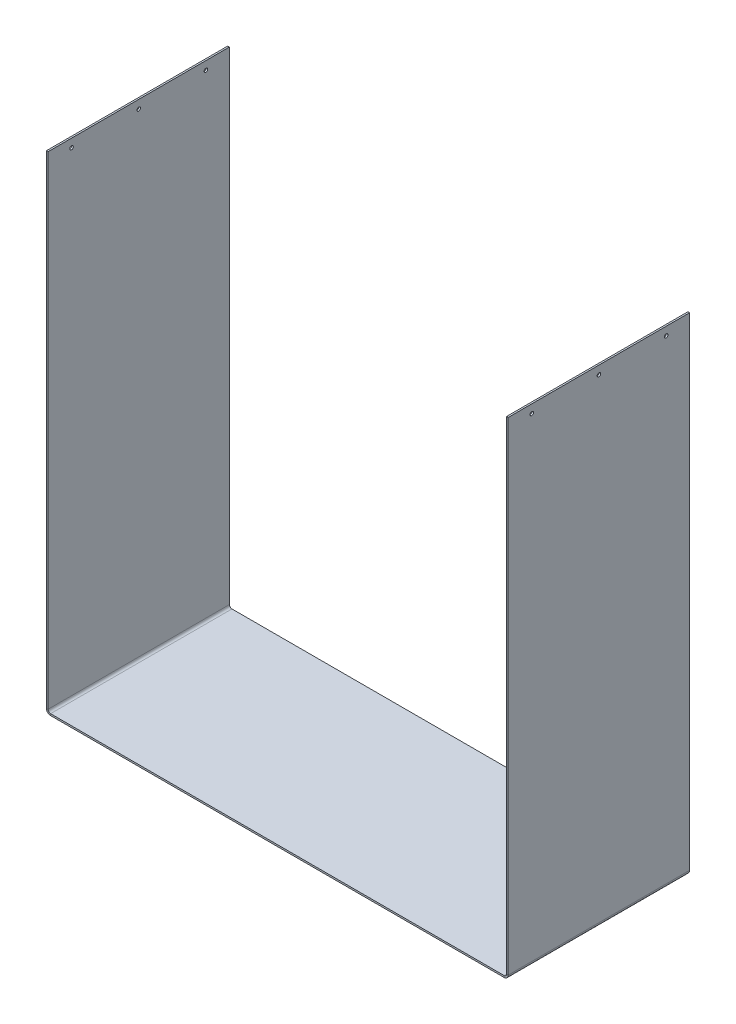
ISO-10303-21;
HEADER;
FILE_DESCRIPTION(('STEP AP214'),'2;1');
FILE_NAME('part.step','',(''),(''),'','','');
FILE_SCHEMA(('AUTOMOTIVE_DESIGN { 1 0 10303 214 1 1 1 1 }'));
ENDSEC;
DATA;
#1=APPLICATION_CONTEXT('core data for automotive mechanical design processes');
#2=APPLICATION_PROTOCOL_DEFINITION('international standard','automotive_design',2000,#1);
#3=PRODUCT_CONTEXT('',#1,'mechanical');
#4=PRODUCT('Part','Part','',(#3));
#5=PRODUCT_RELATED_PRODUCT_CATEGORY('part','',(#4));
#6=PRODUCT_DEFINITION_FORMATION('','',#4);
#7=PRODUCT_DEFINITION_CONTEXT('part definition',#1,'design');
#8=PRODUCT_DEFINITION('design','',#6,#7);
#9=PRODUCT_DEFINITION_SHAPE('','',#8);
#10=(LENGTH_UNIT() NAMED_UNIT(*) SI_UNIT(.MILLI.,.METRE.));
#11=(NAMED_UNIT(*) PLANE_ANGLE_UNIT() SI_UNIT($,.RADIAN.));
#12=(NAMED_UNIT(*) SI_UNIT($,.STERADIAN.) SOLID_ANGLE_UNIT());
#13=UNCERTAINTY_MEASURE_WITH_UNIT(LENGTH_MEASURE(1.E-05),#10,'distance_accuracy_value','');
#14=(GEOMETRIC_REPRESENTATION_CONTEXT(3) GLOBAL_UNCERTAINTY_ASSIGNED_CONTEXT((#13)) GLOBAL_UNIT_ASSIGNED_CONTEXT((#10,
#11,#12)) REPRESENTATION_CONTEXT('',''));
#15=CARTESIAN_POINT('',(0.,0.,0.));
#16=DIRECTION('',(0.,0.,1.));
#17=DIRECTION('',(1.,0.,0.));
#18=AXIS2_PLACEMENT_3D('',#15,#16,#17);
#19=CARTESIAN_POINT('',(0.,-2.,0.));
#20=DIRECTION('',(0.,-1.,0.));
#21=DIRECTION('',(0.,0.,-1.));
#22=AXIS2_PLACEMENT_3D('',#19,#20,#21);
#23=PLANE('',#22);
#24=DIRECTION('',(-1.,0.,0.));
#25=VECTOR('',#24,1.);
#26=CARTESIAN_POINT('',(-273.,-2.,-108.));
#27=LINE('',#26,#25);
#28=CARTESIAN_POINT('',(270.,-1.99999999999999,-108.));
#29=VERTEX_POINT('',#28);
#30=CARTESIAN_POINT('',(-270.,-2.,-108.));
#31=VERTEX_POINT('',#30);
#32=EDGE_CURVE('E49',#29,#31,#27,.T.);
#33=ORIENTED_EDGE('',*,*,#32,.F.);
#34=DIRECTION('',(0.,0.,-1.));
#35=VECTOR('',#34,1.);
#36=CARTESIAN_POINT('',(270.,-1.99999999999999,-108.));
#37=LINE('',#36,#35);
#38=CARTESIAN_POINT('',(270.,-2.,108.));
#39=VERTEX_POINT('',#38);
#40=EDGE_CURVE('E135',#29,#39,#37,.F.);
#41=ORIENTED_EDGE('',*,*,#40,.T.);
#42=DIRECTION('',(1.,0.,0.));
#43=VECTOR('',#42,1.);
#44=CARTESIAN_POINT('',(-273.,-2.,108.));
#45=LINE('',#44,#43);
#46=CARTESIAN_POINT('',(-270.,-1.99999999999999,108.));
#47=VERTEX_POINT('',#46);
#48=EDGE_CURVE('E11',#47,#39,#45,.T.);
#49=ORIENTED_EDGE('',*,*,#48,.F.);
#50=DIRECTION('',(0.,0.,1.));
#51=VECTOR('',#50,1.);
#52=CARTESIAN_POINT('',(-270.,-1.99999999999999,108.));
#53=LINE('',#52,#51);
#54=EDGE_CURVE('E221',#47,#31,#53,.F.);
#55=ORIENTED_EDGE('',*,*,#54,.T.);
#56=EDGE_LOOP('',(#33,#41,#49,#55));
#57=FACE_BOUND('',#56,.T.);
#58=ADVANCED_FACE('F40',(#57),#23,.T.);
#59=CARTESIAN_POINT('',(0.,0.,0.));
#60=DIRECTION('',(0.,-1.,0.));
#61=DIRECTION('',(0.,0.,-1.));
#62=AXIS2_PLACEMENT_3D('',#59,#60,#61);
#63=PLANE('',#62);
#64=DIRECTION('',(0.,0.,-1.));
#65=VECTOR('',#64,1.);
#66=CARTESIAN_POINT('',(270.,0.,-108.));
#67=LINE('',#66,#65);
#68=CARTESIAN_POINT('',(270.,0.,-108.));
#69=VERTEX_POINT('',#68);
#70=CARTESIAN_POINT('',(270.,0.,108.));
#71=VERTEX_POINT('',#70);
#72=EDGE_CURVE('E184',#69,#71,#67,.F.);
#73=ORIENTED_EDGE('',*,*,#72,.F.);
#74=DIRECTION('',(-1.,0.,0.));
#75=VECTOR('',#74,1.);
#76=CARTESIAN_POINT('',(-273.,0.,-108.));
#77=LINE('',#76,#75);
#78=CARTESIAN_POINT('',(-270.,0.,-108.));
#79=VERTEX_POINT('',#78);
#80=EDGE_CURVE('E238',#69,#79,#77,.T.);
#81=ORIENTED_EDGE('',*,*,#80,.T.);
#82=DIRECTION('',(0.,0.,1.));
#83=VECTOR('',#82,1.);
#84=CARTESIAN_POINT('',(-270.,0.,108.));
#85=LINE('',#84,#83);
#86=CARTESIAN_POINT('',(-270.,0.,108.));
#87=VERTEX_POINT('',#86);
#88=EDGE_CURVE('E232',#87,#79,#85,.F.);
#89=ORIENTED_EDGE('',*,*,#88,.F.);
#90=DIRECTION('',(1.,0.,0.));
#91=VECTOR('',#90,1.);
#92=CARTESIAN_POINT('',(-273.,0.,108.));
#93=LINE('',#92,#91);
#94=EDGE_CURVE('E242',#87,#71,#93,.T.);
#95=ORIENTED_EDGE('',*,*,#94,.T.);
#96=EDGE_LOOP('',(#73,#81,#89,#95));
#97=FACE_BOUND('',#96,.T.);
#98=ADVANCED_FACE('F306',(#97),#63,.F.);
#99=CARTESIAN_POINT('',(-273.,-2.,-108.));
#100=DIRECTION('',(0.,0.,-1.));
#101=DIRECTION('',(-1.,0.,0.));
#102=AXIS2_PLACEMENT_3D('',#99,#100,#101);
#103=PLANE('',#102);
#104=ORIENTED_EDGE('',*,*,#80,.F.);
#105=DIRECTION('',(0.,-1.,0.));
#106=VECTOR('',#105,1.);
#107=CARTESIAN_POINT('',(270.,0.,-108.));
#108=LINE('',#107,#106);
#109=EDGE_CURVE('E180',#69,#29,#108,.T.);
#110=ORIENTED_EDGE('',*,*,#109,.T.);
#111=ORIENTED_EDGE('',*,*,#32,.T.);
#112=DIRECTION('',(0.,-1.,0.));
#113=VECTOR('',#112,1.);
#114=CARTESIAN_POINT('',(-270.,0.,-108.));
#115=LINE('',#114,#113);
#116=EDGE_CURVE('E236',#79,#31,#115,.T.);
#117=ORIENTED_EDGE('',*,*,#116,.F.);
#118=EDGE_LOOP('',(#104,#110,#111,#117));
#119=FACE_BOUND('',#118,.T.);
#120=ADVANCED_FACE('F42',(#119),#103,.T.);
#121=CARTESIAN_POINT('',(-273.,-2.,108.));
#122=DIRECTION('',(0.,0.,1.));
#123=DIRECTION('',(1.,0.,0.));
#124=AXIS2_PLACEMENT_3D('',#121,#122,#123);
#125=PLANE('',#124);
#126=DIRECTION('',(0.,-1.,0.));
#127=VECTOR('',#126,1.);
#128=CARTESIAN_POINT('',(270.,0.,108.));
#129=LINE('',#128,#127);
#130=EDGE_CURVE('E187',#71,#39,#129,.T.);
#131=ORIENTED_EDGE('',*,*,#130,.F.);
#132=ORIENTED_EDGE('',*,*,#94,.F.);
#133=DIRECTION('',(0.,-1.,0.));
#134=VECTOR('',#133,1.);
#135=CARTESIAN_POINT('',(-270.,0.,108.));
#136=LINE('',#135,#134);
#137=EDGE_CURVE('E226',#87,#47,#136,.T.);
#138=ORIENTED_EDGE('',*,*,#137,.T.);
#139=ORIENTED_EDGE('',*,*,#48,.T.);
#140=EDGE_LOOP('',(#131,#132,#138,#139));
#141=FACE_BOUND('',#140,.T.);
#142=ADVANCED_FACE('F318',(#141),#125,.T.);
#143=CARTESIAN_POINT('',(-270.,3.00000000000001,-108.));
#144=DIRECTION('',(0.,0.,-1.));
#145=DIRECTION('',(-1.,0.,0.));
#146=AXIS2_PLACEMENT_3D('',#143,#144,#145);
#147=PLANE('',#146);
#148=DIRECTION('',(-1.,0.,0.));
#149=VECTOR('',#148,1.);
#150=CARTESIAN_POINT('',(-273.,3.,-108.));
#151=LINE('',#150,#149);
#152=CARTESIAN_POINT('',(-273.,3.,-108.));
#153=VERTEX_POINT('',#152);
#154=CARTESIAN_POINT('',(-275.,3.,-108.));
#155=VERTEX_POINT('',#154);
#156=EDGE_CURVE('E189',#153,#155,#151,.T.);
#157=ORIENTED_EDGE('',*,*,#156,.F.);
#158=CARTESIAN_POINT('',(-270.,3.00000000000001,-108.));
#159=DIRECTION('',(0.,0.,1.));
#160=DIRECTION('',(1.,0.,0.));
#161=AXIS2_PLACEMENT_3D('',#158,#159,#160);
#162=CIRCLE('',#161,3.);
#163=EDGE_CURVE('E229',#79,#153,#162,.F.);
#164=ORIENTED_EDGE('',*,*,#163,.F.);
#165=ORIENTED_EDGE('',*,*,#116,.T.);
#166=CARTESIAN_POINT('',(-270.,3.00000000000001,-108.));
#167=DIRECTION('',(0.,0.,1.));
#168=DIRECTION('',(1.,0.,0.));
#169=AXIS2_PLACEMENT_3D('',#166,#167,#168);
#170=CIRCLE('',#169,5.);
#171=EDGE_CURVE('E57',#31,#155,#170,.F.);
#172=ORIENTED_EDGE('',*,*,#171,.T.);
#173=EDGE_LOOP('',(#157,#164,#165,#172));
#174=FACE_BOUND('',#173,.T.);
#175=ADVANCED_FACE('F320',(#174),#147,.T.);
#176=CARTESIAN_POINT('',(-270.,3.00000000000001,108.));
#177=DIRECTION('',(0.,0.,-1.));
#178=DIRECTION('',(-1.,0.,0.));
#179=AXIS2_PLACEMENT_3D('',#176,#177,#178);
#180=PLANE('',#179);
#181=CARTESIAN_POINT('',(-270.,3.00000000000001,108.));
#182=DIRECTION('',(0.,0.,1.));
#183=DIRECTION('',(1.,0.,0.));
#184=AXIS2_PLACEMENT_3D('',#181,#182,#183);
#185=CIRCLE('',#184,3.);
#186=CARTESIAN_POINT('',(-273.,3.,108.));
#187=VERTEX_POINT('',#186);
#188=EDGE_CURVE('E220',#187,#87,#185,.T.);
#189=ORIENTED_EDGE('',*,*,#188,.F.);
#190=DIRECTION('',(-1.,0.,0.));
#191=VECTOR('',#190,1.);
#192=CARTESIAN_POINT('',(-273.,3.,108.));
#193=LINE('',#192,#191);
#194=CARTESIAN_POINT('',(-275.,3.,108.));
#195=VERTEX_POINT('',#194);
#196=EDGE_CURVE('E193',#187,#195,#193,.T.);
#197=ORIENTED_EDGE('',*,*,#196,.T.);
#198=CARTESIAN_POINT('',(-270.,3.00000000000001,108.));
#199=DIRECTION('',(0.,0.,1.));
#200=DIRECTION('',(1.,0.,0.));
#201=AXIS2_PLACEMENT_3D('',#198,#199,#200);
#202=CIRCLE('',#201,5.);
#203=EDGE_CURVE('E224',#195,#47,#202,.T.);
#204=ORIENTED_EDGE('',*,*,#203,.T.);
#205=ORIENTED_EDGE('',*,*,#137,.F.);
#206=EDGE_LOOP('',(#189,#197,#204,#205));
#207=FACE_BOUND('',#206,.T.);
#208=ADVANCED_FACE('F316',(#207),#180,.F.);
#209=CARTESIAN_POINT('',(-270.,3.00000000000001,108.));
#210=DIRECTION('',(0.,0.,1.));
#211=DIRECTION('',(-1.,0.,0.));
#212=AXIS2_PLACEMENT_3D('',#209,#210,#211);
#213=CYLINDRICAL_SURFACE('',#212,5.);
#214=ORIENTED_EDGE('',*,*,#54,.F.);
#215=ORIENTED_EDGE('',*,*,#203,.F.);
#216=DIRECTION('',(0.,0.,-1.));
#217=VECTOR('',#216,1.);
#218=CARTESIAN_POINT('',(-275.,3.,0.));
#219=LINE('',#218,#217);
#220=EDGE_CURVE('E196',#195,#155,#219,.T.);
#221=ORIENTED_EDGE('',*,*,#220,.T.);
#222=ORIENTED_EDGE('',*,*,#171,.F.);
#223=EDGE_LOOP('',(#214,#215,#221,#222));
#224=FACE_BOUND('',#223,.T.);
#225=ADVANCED_FACE('F366',(#224),#213,.T.);
#226=CARTESIAN_POINT('',(-270.,3.00000000000001,108.));
#227=DIRECTION('',(0.,0.,1.));
#228=DIRECTION('',(-1.,0.,0.));
#229=AXIS2_PLACEMENT_3D('',#226,#227,#228);
#230=CYLINDRICAL_SURFACE('',#229,3.);
#231=ORIENTED_EDGE('',*,*,#88,.T.);
#232=ORIENTED_EDGE('',*,*,#163,.T.);
#233=DIRECTION('',(0.,0.,1.));
#234=VECTOR('',#233,1.);
#235=CARTESIAN_POINT('',(-273.,3.,-108.));
#236=LINE('',#235,#234);
#237=EDGE_CURVE('E191',#153,#187,#236,.T.);
#238=ORIENTED_EDGE('',*,*,#237,.T.);
#239=ORIENTED_EDGE('',*,*,#188,.T.);
#240=EDGE_LOOP('',(#231,#232,#238,#239));
#241=FACE_BOUND('',#240,.T.);
#242=ADVANCED_FACE('F335',(#241),#230,.F.);
#243=CARTESIAN_POINT('',(-275.000000000002,578.,108.));
#244=DIRECTION('',(0.,0.,-1.));
#245=DIRECTION('',(0.,1.,0.));
#246=AXIS2_PLACEMENT_3D('',#243,#244,#245);
#247=PLANE('',#246);
#248=ORIENTED_EDGE('',*,*,#196,.F.);
#249=DIRECTION('',(0.,1.,0.));
#250=VECTOR('',#249,1.);
#251=CARTESIAN_POINT('',(-273.000000000002,578.,108.));
#252=LINE('',#251,#250);
#253=CARTESIAN_POINT('',(-273.000000000002,578.,108.));
#254=VERTEX_POINT('',#253);
#255=EDGE_CURVE('E200',#187,#254,#252,.T.);
#256=ORIENTED_EDGE('',*,*,#255,.T.);
#257=DIRECTION('',(1.,0.,0.));
#258=VECTOR('',#257,1.);
#259=CARTESIAN_POINT('',(-275.000000000002,578.,108.));
#260=LINE('',#259,#258);
#261=CARTESIAN_POINT('',(-275.000000000002,578.,108.));
#262=VERTEX_POINT('',#261);
#263=EDGE_CURVE('E217',#262,#254,#260,.T.);
#264=ORIENTED_EDGE('',*,*,#263,.F.);
#265=DIRECTION('',(0.,1.,0.));
#266=VECTOR('',#265,1.);
#267=CARTESIAN_POINT('',(-275.000000000002,578.,108.));
#268=LINE('',#267,#266);
#269=EDGE_CURVE('E201',#195,#262,#268,.T.);
#270=ORIENTED_EDGE('',*,*,#269,.F.);
#271=EDGE_LOOP('',(#248,#256,#264,#270));
#272=FACE_BOUND('',#271,.T.);
#273=ADVANCED_FACE('F358',(#272),#247,.F.);
#274=CARTESIAN_POINT('',(-275.,0.,-108.));
#275=DIRECTION('',(0.,0.,1.));
#276=DIRECTION('',(0.,-1.,0.));
#277=AXIS2_PLACEMENT_3D('',#274,#275,#276);
#278=PLANE('',#277);
#279=ORIENTED_EDGE('',*,*,#156,.T.);
#280=DIRECTION('',(0.,-1.,0.));
#281=VECTOR('',#280,1.);
#282=CARTESIAN_POINT('',(-275.,0.,-108.));
#283=LINE('',#282,#281);
#284=CARTESIAN_POINT('',(-275.000000000002,578.,-108.));
#285=VERTEX_POINT('',#284);
#286=EDGE_CURVE('E206',#285,#155,#283,.T.);
#287=ORIENTED_EDGE('',*,*,#286,.F.);
#288=DIRECTION('',(1.,0.,0.));
#289=VECTOR('',#288,1.);
#290=CARTESIAN_POINT('',(-275.000000000002,578.,-108.));
#291=LINE('',#290,#289);
#292=CARTESIAN_POINT('',(-273.000000000002,578.,-108.));
#293=VERTEX_POINT('',#292);
#294=EDGE_CURVE('E209',#285,#293,#291,.T.);
#295=ORIENTED_EDGE('',*,*,#294,.T.);
#296=DIRECTION('',(0.,-1.,0.));
#297=VECTOR('',#296,1.);
#298=CARTESIAN_POINT('',(-273.,0.,-108.));
#299=LINE('',#298,#297);
#300=EDGE_CURVE('E204',#293,#153,#299,.T.);
#301=ORIENTED_EDGE('',*,*,#300,.T.);
#302=EDGE_LOOP('',(#279,#287,#295,#301));
#303=FACE_BOUND('',#302,.T.);
#304=ADVANCED_FACE('F340',(#303),#278,.F.);
#305=CARTESIAN_POINT('',(-275.,-9.50864613717136E-13,0.));
#306=DIRECTION('',(1.,0.,0.));
#307=DIRECTION('',(0.,1.,0.));
#308=AXIS2_PLACEMENT_3D('',#305,#306,#307);
#309=PLANE('',#308);
#310=CARTESIAN_POINT('',(-275.000000000002,568.,80.));
#311=DIRECTION('',(-1.,0.,0.));
#312=DIRECTION('',(0.,-1.,0.));
#313=AXIS2_PLACEMENT_3D('',#310,#311,#312);
#314=CIRCLE('',#313,2.10000000000002);
#315=CARTESIAN_POINT('',(-275.000000000002,565.9,80.));
#316=VERTEX_POINT('',#315);
#317=EDGE_CURVE('E621',#316,#316,#314,.T.);
#318=ORIENTED_EDGE('',*,*,#317,.F.);
#319=EDGE_LOOP('',(#318));
#320=FACE_BOUND('',#319,.T.);
#321=CARTESIAN_POINT('',(-275.000000000002,568.,-80.));
#322=DIRECTION('',(-1.,0.,0.));
#323=DIRECTION('',(0.,1.,0.));
#324=AXIS2_PLACEMENT_3D('',#321,#322,#323);
#325=CIRCLE('',#324,2.10000000000002);
#326=CARTESIAN_POINT('',(-275.000000000002,570.1,-80.));
#327=VERTEX_POINT('',#326);
#328=EDGE_CURVE('E625',#327,#327,#325,.T.);
#329=ORIENTED_EDGE('',*,*,#328,.F.);
#330=EDGE_LOOP('',(#329));
#331=FACE_BOUND('',#330,.T.);
#332=CARTESIAN_POINT('',(-275.000000000002,568.,0.));
#333=DIRECTION('',(-1.,0.,0.));
#334=DIRECTION('',(0.,-1.,0.));
#335=AXIS2_PLACEMENT_3D('',#332,#333,#334);
#336=CIRCLE('',#335,2.10000000000001);
#337=CARTESIAN_POINT('',(-275.000000000002,565.9,0.));
#338=VERTEX_POINT('',#337);
#339=EDGE_CURVE('E264',#338,#338,#336,.T.);
#340=ORIENTED_EDGE('',*,*,#339,.F.);
#341=EDGE_LOOP('',(#340));
#342=FACE_BOUND('',#341,.T.);
#343=ORIENTED_EDGE('',*,*,#220,.F.);
#344=ORIENTED_EDGE('',*,*,#269,.T.);
#345=DIRECTION('',(0.,0.,-1.));
#346=VECTOR('',#345,1.);
#347=CARTESIAN_POINT('',(-275.000000000002,578.,-108.));
#348=LINE('',#347,#346);
#349=EDGE_CURVE('E203',#262,#285,#348,.T.);
#350=ORIENTED_EDGE('',*,*,#349,.T.);
#351=ORIENTED_EDGE('',*,*,#286,.T.);
#352=EDGE_LOOP('',(#343,#344,#350,#351));
#353=FACE_BOUND('',#352,.T.);
#354=ADVANCED_FACE('F344',(#320,#331,#342,#353),#309,.F.);
#355=CARTESIAN_POINT('',(-273.,-9.4388165103945E-13,0.));
#356=DIRECTION('',(1.,0.,0.));
#357=DIRECTION('',(0.,1.,0.));
#358=AXIS2_PLACEMENT_3D('',#355,#356,#357);
#359=PLANE('',#358);
#360=CARTESIAN_POINT('',(-273.000000000002,568.,80.));
#361=DIRECTION('',(1.,0.,0.));
#362=DIRECTION('',(0.,1.,0.));
#363=AXIS2_PLACEMENT_3D('',#360,#361,#362);
#364=CIRCLE('',#363,2.10000000000002);
#365=CARTESIAN_POINT('',(-273.000000000002,570.1,80.));
#366=VERTEX_POINT('',#365);
#367=EDGE_CURVE('E267',#366,#366,#364,.T.);
#368=ORIENTED_EDGE('',*,*,#367,.F.);
#369=EDGE_LOOP('',(#368));
#370=FACE_BOUND('',#369,.T.);
#371=CARTESIAN_POINT('',(-273.000000000002,568.,-80.));
#372=DIRECTION('',(1.,0.,0.));
#373=DIRECTION('',(0.,1.,0.));
#374=AXIS2_PLACEMENT_3D('',#371,#372,#373);
#375=CIRCLE('',#374,2.10000000000002);
#376=CARTESIAN_POINT('',(-273.000000000002,570.1,-80.));
#377=VERTEX_POINT('',#376);
#378=EDGE_CURVE('E254',#377,#377,#375,.T.);
#379=ORIENTED_EDGE('',*,*,#378,.F.);
#380=EDGE_LOOP('',(#379));
#381=FACE_BOUND('',#380,.T.);
#382=CARTESIAN_POINT('',(-273.000000000002,568.,0.));
#383=DIRECTION('',(1.,0.,0.));
#384=DIRECTION('',(0.,1.,0.));
#385=AXIS2_PLACEMENT_3D('',#382,#383,#384);
#386=CIRCLE('',#385,2.10000000000001);
#387=CARTESIAN_POINT('',(-273.000000000002,570.1,0.));
#388=VERTEX_POINT('',#387);
#389=EDGE_CURVE('E250',#388,#388,#386,.T.);
#390=ORIENTED_EDGE('',*,*,#389,.F.);
#391=EDGE_LOOP('',(#390));
#392=FACE_BOUND('',#391,.T.);
#393=ORIENTED_EDGE('',*,*,#255,.F.);
#394=ORIENTED_EDGE('',*,*,#237,.F.);
#395=ORIENTED_EDGE('',*,*,#300,.F.);
#396=DIRECTION('',(0.,0.,-1.));
#397=VECTOR('',#396,1.);
#398=CARTESIAN_POINT('',(-273.000000000002,578.,-108.));
#399=LINE('',#398,#397);
#400=EDGE_CURVE('E211',#254,#293,#399,.T.);
#401=ORIENTED_EDGE('',*,*,#400,.F.);
#402=EDGE_LOOP('',(#393,#394,#395,#401));
#403=FACE_BOUND('',#402,.T.);
#404=ADVANCED_FACE('F354',(#370,#381,#392,#403),#359,.T.);
#405=CARTESIAN_POINT('',(-275.000000000002,578.,-108.));
#406=DIRECTION('',(0.,-1.,0.));
#407=DIRECTION('',(1.,0.,0.));
#408=AXIS2_PLACEMENT_3D('',#405,#406,#407);
#409=PLANE('',#408);
#410=ORIENTED_EDGE('',*,*,#400,.T.);
#411=ORIENTED_EDGE('',*,*,#294,.F.);
#412=ORIENTED_EDGE('',*,*,#349,.F.);
#413=ORIENTED_EDGE('',*,*,#263,.T.);
#414=EDGE_LOOP('',(#410,#411,#412,#413));
#415=FACE_BOUND('',#414,.T.);
#416=ADVANCED_FACE('F350',(#415),#409,.F.);
#417=CARTESIAN_POINT('',(270.,3.00000000000001,108.));
#418=DIRECTION('',(0.,0.,1.));
#419=DIRECTION('',(1.,0.,0.));
#420=AXIS2_PLACEMENT_3D('',#417,#418,#419);
#421=PLANE('',#420);
#422=DIRECTION('',(1.,0.,0.));
#423=VECTOR('',#422,1.);
#424=CARTESIAN_POINT('',(273.,3.,108.));
#425=LINE('',#424,#423);
#426=CARTESIAN_POINT('',(273.,3.,108.));
#427=VERTEX_POINT('',#426);
#428=CARTESIAN_POINT('',(275.,3.,108.));
#429=VERTEX_POINT('',#428);
#430=EDGE_CURVE('E270',#427,#429,#425,.T.);
#431=ORIENTED_EDGE('',*,*,#430,.F.);
#432=CARTESIAN_POINT('',(270.,3.00000000000001,108.));
#433=DIRECTION('',(0.,0.,-1.));
#434=DIRECTION('',(-1.,0.,0.));
#435=AXIS2_PLACEMENT_3D('',#432,#433,#434);
#436=CIRCLE('',#435,3.);
#437=EDGE_CURVE('E138',#71,#427,#436,.F.);
#438=ORIENTED_EDGE('',*,*,#437,.F.);
#439=ORIENTED_EDGE('',*,*,#130,.T.);
#440=CARTESIAN_POINT('',(270.,3.00000000000001,108.));
#441=DIRECTION('',(0.,0.,-1.));
#442=DIRECTION('',(-1.,0.,0.));
#443=AXIS2_PLACEMENT_3D('',#440,#441,#442);
#444=CIRCLE('',#443,5.);
#445=EDGE_CURVE('E65',#39,#429,#444,.F.);
#446=ORIENTED_EDGE('',*,*,#445,.T.);
#447=EDGE_LOOP('',(#431,#438,#439,#446));
#448=FACE_BOUND('',#447,.T.);
#449=ADVANCED_FACE('F278',(#448),#421,.T.);
#450=CARTESIAN_POINT('',(270.,3.00000000000001,-108.));
#451=DIRECTION('',(0.,0.,1.));
#452=DIRECTION('',(1.,0.,0.));
#453=AXIS2_PLACEMENT_3D('',#450,#451,#452);
#454=PLANE('',#453);
#455=CARTESIAN_POINT('',(270.,3.00000000000001,-108.));
#456=DIRECTION('',(0.,0.,-1.));
#457=DIRECTION('',(-1.,0.,0.));
#458=AXIS2_PLACEMENT_3D('',#455,#456,#457);
#459=CIRCLE('',#458,3.);
#460=CARTESIAN_POINT('',(273.,3.,-108.));
#461=VERTEX_POINT('',#460);
#462=EDGE_CURVE('E145',#461,#69,#459,.T.);
#463=ORIENTED_EDGE('',*,*,#462,.F.);
#464=DIRECTION('',(1.,0.,0.));
#465=VECTOR('',#464,1.);
#466=CARTESIAN_POINT('',(273.,3.,-108.));
#467=LINE('',#466,#465);
#468=CARTESIAN_POINT('',(275.,3.,-108.));
#469=VERTEX_POINT('',#468);
#470=EDGE_CURVE('E142',#461,#469,#467,.T.);
#471=ORIENTED_EDGE('',*,*,#470,.T.);
#472=CARTESIAN_POINT('',(270.,3.00000000000001,-108.));
#473=DIRECTION('',(0.,0.,-1.));
#474=DIRECTION('',(-1.,0.,0.));
#475=AXIS2_PLACEMENT_3D('',#472,#473,#474);
#476=CIRCLE('',#475,5.);
#477=EDGE_CURVE('E129',#469,#29,#476,.T.);
#478=ORIENTED_EDGE('',*,*,#477,.T.);
#479=ORIENTED_EDGE('',*,*,#109,.F.);
#480=EDGE_LOOP('',(#463,#471,#478,#479));
#481=FACE_BOUND('',#480,.T.);
#482=ADVANCED_FACE('F143',(#481),#454,.F.);
#483=CARTESIAN_POINT('',(270.,3.00000000000001,-108.));
#484=DIRECTION('',(0.,0.,-1.));
#485=DIRECTION('',(1.,0.,0.));
#486=AXIS2_PLACEMENT_3D('',#483,#484,#485);
#487=CYLINDRICAL_SURFACE('',#486,5.);
#488=ORIENTED_EDGE('',*,*,#40,.F.);
#489=ORIENTED_EDGE('',*,*,#477,.F.);
#490=DIRECTION('',(0.,0.,1.));
#491=VECTOR('',#490,1.);
#492=CARTESIAN_POINT('',(275.,3.,0.));
#493=LINE('',#492,#491);
#494=EDGE_CURVE('E133',#469,#429,#493,.T.);
#495=ORIENTED_EDGE('',*,*,#494,.T.);
#496=ORIENTED_EDGE('',*,*,#445,.F.);
#497=EDGE_LOOP('',(#488,#489,#495,#496));
#498=FACE_BOUND('',#497,.T.);
#499=ADVANCED_FACE('F131',(#498),#487,.T.);
#500=CARTESIAN_POINT('',(270.,3.00000000000001,-108.));
#501=DIRECTION('',(0.,0.,-1.));
#502=DIRECTION('',(1.,0.,0.));
#503=AXIS2_PLACEMENT_3D('',#500,#501,#502);
#504=CYLINDRICAL_SURFACE('',#503,3.);
#505=ORIENTED_EDGE('',*,*,#72,.T.);
#506=ORIENTED_EDGE('',*,*,#437,.T.);
#507=DIRECTION('',(0.,0.,-1.));
#508=VECTOR('',#507,1.);
#509=CARTESIAN_POINT('',(273.,3.,108.));
#510=LINE('',#509,#508);
#511=EDGE_CURVE('E149',#427,#461,#510,.T.);
#512=ORIENTED_EDGE('',*,*,#511,.T.);
#513=ORIENTED_EDGE('',*,*,#462,.T.);
#514=EDGE_LOOP('',(#505,#506,#512,#513));
#515=FACE_BOUND('',#514,.T.);
#516=ADVANCED_FACE('F282',(#515),#504,.F.);
#517=CARTESIAN_POINT('',(275.,0.,108.));
#518=DIRECTION('',(0.,0.,-1.));
#519=DIRECTION('',(0.,1.,0.));
#520=AXIS2_PLACEMENT_3D('',#517,#518,#519);
#521=PLANE('',#520);
#522=ORIENTED_EDGE('',*,*,#430,.T.);
#523=DIRECTION('',(0.,-1.,0.));
#524=VECTOR('',#523,1.);
#525=CARTESIAN_POINT('',(275.,0.,108.));
#526=LINE('',#525,#524);
#527=CARTESIAN_POINT('',(275.000000000002,578.,108.));
#528=VERTEX_POINT('',#527);
#529=EDGE_CURVE('E157',#528,#429,#526,.T.);
#530=ORIENTED_EDGE('',*,*,#529,.F.);
#531=DIRECTION('',(-1.,0.,0.));
#532=VECTOR('',#531,1.);
#533=CARTESIAN_POINT('',(275.000000000002,578.,108.));
#534=LINE('',#533,#532);
#535=CARTESIAN_POINT('',(273.000000000002,578.,108.));
#536=VERTEX_POINT('',#535);
#537=EDGE_CURVE('E166',#528,#536,#534,.T.);
#538=ORIENTED_EDGE('',*,*,#537,.T.);
#539=DIRECTION('',(0.,-1.,0.));
#540=VECTOR('',#539,1.);
#541=CARTESIAN_POINT('',(273.,0.,108.));
#542=LINE('',#541,#540);
#543=EDGE_CURVE('E158',#536,#427,#542,.T.);
#544=ORIENTED_EDGE('',*,*,#543,.T.);
#545=EDGE_LOOP('',(#522,#530,#538,#544));
#546=FACE_BOUND('',#545,.T.);
#547=ADVANCED_FACE('F274',(#546),#521,.F.);
#548=CARTESIAN_POINT('',(275.000000000002,578.,-108.));
#549=DIRECTION('',(0.,0.,1.));
#550=DIRECTION('',(0.,-1.,0.));
#551=AXIS2_PLACEMENT_3D('',#548,#549,#550);
#552=PLANE('',#551);
#553=ORIENTED_EDGE('',*,*,#470,.F.);
#554=DIRECTION('',(0.,1.,0.));
#555=VECTOR('',#554,1.);
#556=CARTESIAN_POINT('',(273.000000000002,578.,-108.));
#557=LINE('',#556,#555);
#558=CARTESIAN_POINT('',(273.000000000002,578.,-108.));
#559=VERTEX_POINT('',#558);
#560=EDGE_CURVE('E173',#461,#559,#557,.T.);
#561=ORIENTED_EDGE('',*,*,#560,.T.);
#562=DIRECTION('',(-1.,0.,0.));
#563=VECTOR('',#562,1.);
#564=CARTESIAN_POINT('',(275.000000000002,578.,-108.));
#565=LINE('',#564,#563);
#566=CARTESIAN_POINT('',(275.000000000002,578.,-108.));
#567=VERTEX_POINT('',#566);
#568=EDGE_CURVE('E162',#567,#559,#565,.T.);
#569=ORIENTED_EDGE('',*,*,#568,.F.);
#570=DIRECTION('',(0.,1.,0.));
#571=VECTOR('',#570,1.);
#572=CARTESIAN_POINT('',(275.000000000002,578.,-108.));
#573=LINE('',#572,#571);
#574=EDGE_CURVE('E154',#469,#567,#573,.T.);
#575=ORIENTED_EDGE('',*,*,#574,.F.);
#576=EDGE_LOOP('',(#553,#561,#569,#575));
#577=FACE_BOUND('',#576,.T.);
#578=ADVANCED_FACE('F160',(#577),#552,.F.);
#579=CARTESIAN_POINT('',(275.,-9.50864613717136E-13,0.));
#580=DIRECTION('',(-1.,0.,0.));
#581=DIRECTION('',(0.,-1.,0.));
#582=AXIS2_PLACEMENT_3D('',#579,#580,#581);
#583=PLANE('',#582);
#584=CARTESIAN_POINT('',(275.000000000002,568.000000000002,80.));
#585=DIRECTION('',(-1.,0.,0.));
#586=DIRECTION('',(0.,-1.,0.));
#587=AXIS2_PLACEMENT_3D('',#584,#585,#586);
#588=CIRCLE('',#587,2.10000000000002);
#589=CARTESIAN_POINT('',(275.000000000002,565.900000000002,80.));
#590=VERTEX_POINT('',#589);
#591=EDGE_CURVE('E622',#590,#590,#588,.T.);
#592=ORIENTED_EDGE('',*,*,#591,.T.);
#593=EDGE_LOOP('',(#592));
#594=FACE_BOUND('',#593,.T.);
#595=CARTESIAN_POINT('',(275.000000000002,568.000000000002,-80.));
#596=DIRECTION('',(-1.,0.,0.));
#597=DIRECTION('',(0.,1.,0.));
#598=AXIS2_PLACEMENT_3D('',#595,#596,#597);
#599=CIRCLE('',#598,2.10000000000002);
#600=CARTESIAN_POINT('',(275.000000000002,570.100000000002,-80.));
#601=VERTEX_POINT('',#600);
#602=EDGE_CURVE('E632',#601,#601,#599,.T.);
#603=ORIENTED_EDGE('',*,*,#602,.T.);
#604=EDGE_LOOP('',(#603));
#605=FACE_BOUND('',#604,.T.);
#606=CARTESIAN_POINT('',(275.000000000002,568.000000000002,0.));
#607=DIRECTION('',(-1.,0.,0.));
#608=DIRECTION('',(0.,-1.,0.));
#609=AXIS2_PLACEMENT_3D('',#606,#607,#608);
#610=CIRCLE('',#609,2.10000000000001);
#611=CARTESIAN_POINT('',(275.000000000002,565.900000000002,0.));
#612=VERTEX_POINT('',#611);
#613=EDGE_CURVE('E251',#612,#612,#610,.T.);
#614=ORIENTED_EDGE('',*,*,#613,.T.);
#615=EDGE_LOOP('',(#614));
#616=FACE_BOUND('',#615,.T.);
#617=ORIENTED_EDGE('',*,*,#494,.F.);
#618=ORIENTED_EDGE('',*,*,#574,.T.);
#619=DIRECTION('',(0.,0.,1.));
#620=VECTOR('',#619,1.);
#621=CARTESIAN_POINT('',(275.000000000002,578.,108.));
#622=LINE('',#621,#620);
#623=EDGE_CURVE('E164',#567,#528,#622,.T.);
#624=ORIENTED_EDGE('',*,*,#623,.T.);
#625=ORIENTED_EDGE('',*,*,#529,.T.);
#626=EDGE_LOOP('',(#617,#618,#624,#625));
#627=FACE_BOUND('',#626,.T.);
#628=ADVANCED_FACE('F153',(#594,#605,#616,#627),#583,.F.);
#629=CARTESIAN_POINT('',(273.,-9.4388165103945E-13,0.));
#630=DIRECTION('',(-1.,0.,0.));
#631=DIRECTION('',(0.,-1.,0.));
#632=AXIS2_PLACEMENT_3D('',#629,#630,#631);
#633=PLANE('',#632);
#634=CARTESIAN_POINT('',(273.000000000002,568.000000000002,80.));
#635=DIRECTION('',(-1.,0.,0.));
#636=DIRECTION('',(0.,-1.,0.));
#637=AXIS2_PLACEMENT_3D('',#634,#635,#636);
#638=CIRCLE('',#637,2.10000000000002);
#639=CARTESIAN_POINT('',(273.000000000002,565.900000000002,80.));
#640=VERTEX_POINT('',#639);
#641=EDGE_CURVE('E44',#640,#640,#638,.T.);
#642=ORIENTED_EDGE('',*,*,#641,.F.);
#643=EDGE_LOOP('',(#642));
#644=FACE_BOUND('',#643,.T.);
#645=CARTESIAN_POINT('',(273.000000000002,568.000000000002,-80.));
#646=DIRECTION('',(-1.,0.,0.));
#647=DIRECTION('',(0.,-1.,0.));
#648=AXIS2_PLACEMENT_3D('',#645,#646,#647);
#649=CIRCLE('',#648,2.10000000000002);
#650=CARTESIAN_POINT('',(273.000000000002,565.900000000002,-80.));
#651=VERTEX_POINT('',#650);
#652=EDGE_CURVE('E252',#651,#651,#649,.T.);
#653=ORIENTED_EDGE('',*,*,#652,.F.);
#654=EDGE_LOOP('',(#653));
#655=FACE_BOUND('',#654,.T.);
#656=CARTESIAN_POINT('',(273.000000000002,568.000000000002,0.));
#657=DIRECTION('',(-1.,0.,0.));
#658=DIRECTION('',(0.,-1.,0.));
#659=AXIS2_PLACEMENT_3D('',#656,#657,#658);
#660=CIRCLE('',#659,2.10000000000001);
#661=CARTESIAN_POINT('',(273.000000000002,565.900000000002,0.));
#662=VERTEX_POINT('',#661);
#663=EDGE_CURVE('E248',#662,#662,#660,.T.);
#664=ORIENTED_EDGE('',*,*,#663,.F.);
#665=EDGE_LOOP('',(#664));
#666=FACE_BOUND('',#665,.T.);
#667=ORIENTED_EDGE('',*,*,#560,.F.);
#668=ORIENTED_EDGE('',*,*,#511,.F.);
#669=ORIENTED_EDGE('',*,*,#543,.F.);
#670=DIRECTION('',(0.,0.,1.));
#671=VECTOR('',#670,1.);
#672=CARTESIAN_POINT('',(273.000000000002,578.,108.));
#673=LINE('',#672,#671);
#674=EDGE_CURVE('E168',#559,#536,#673,.T.);
#675=ORIENTED_EDGE('',*,*,#674,.F.);
#676=EDGE_LOOP('',(#667,#668,#669,#675));
#677=FACE_BOUND('',#676,.T.);
#678=ADVANCED_FACE('F285',(#644,#655,#666,#677),#633,.T.);
#679=CARTESIAN_POINT('',(275.000000000002,578.,108.));
#680=DIRECTION('',(0.,-1.,0.));
#681=DIRECTION('',(1.,0.,0.));
#682=AXIS2_PLACEMENT_3D('',#679,#680,#681);
#683=PLANE('',#682);
#684=ORIENTED_EDGE('',*,*,#674,.T.);
#685=ORIENTED_EDGE('',*,*,#537,.F.);
#686=ORIENTED_EDGE('',*,*,#623,.F.);
#687=ORIENTED_EDGE('',*,*,#568,.T.);
#688=EDGE_LOOP('',(#684,#685,#686,#687));
#689=FACE_BOUND('',#688,.T.);
#690=ADVANCED_FACE('F288',(#689),#683,.F.);
#691=CARTESIAN_POINT('',(275.000000000002,568.000000000002,0.));
#692=DIRECTION('',(-1.,0.,0.));
#693=DIRECTION('',(0.,-1.,0.));
#694=AXIS2_PLACEMENT_3D('',#691,#692,#693);
#695=CYLINDRICAL_SURFACE('',#694,2.10000000000001);
#696=ORIENTED_EDGE('',*,*,#663,.T.);
#697=EDGE_LOOP('',(#696));
#698=FACE_BOUND('',#697,.T.);
#699=ORIENTED_EDGE('',*,*,#613,.F.);
#700=EDGE_LOOP('',(#699));
#701=FACE_BOUND('',#700,.T.);
#702=ADVANCED_FACE('F291',(#698,#701),#695,.F.);
#703=CARTESIAN_POINT('',(275.000000000002,568.000000000002,-80.));
#704=DIRECTION('',(-1.,0.,0.));
#705=DIRECTION('',(0.,-1.,0.));
#706=AXIS2_PLACEMENT_3D('',#703,#704,#705);
#707=CYLINDRICAL_SURFACE('',#706,2.10000000000002);
#708=ORIENTED_EDGE('',*,*,#652,.T.);
#709=EDGE_LOOP('',(#708));
#710=FACE_BOUND('',#709,.T.);
#711=ORIENTED_EDGE('',*,*,#602,.F.);
#712=EDGE_LOOP('',(#711));
#713=FACE_BOUND('',#712,.T.);
#714=ADVANCED_FACE('F297',(#710,#713),#707,.F.);
#715=CARTESIAN_POINT('',(275.000000000002,568.000000000002,80.));
#716=DIRECTION('',(-1.,0.,0.));
#717=DIRECTION('',(0.,-1.,0.));
#718=AXIS2_PLACEMENT_3D('',#715,#716,#717);
#719=CYLINDRICAL_SURFACE('',#718,2.10000000000002);
#720=ORIENTED_EDGE('',*,*,#641,.T.);
#721=EDGE_LOOP('',(#720));
#722=FACE_BOUND('',#721,.T.);
#723=ORIENTED_EDGE('',*,*,#591,.F.);
#724=EDGE_LOOP('',(#723));
#725=FACE_BOUND('',#724,.T.);
#726=ADVANCED_FACE('F538',(#722,#725),#719,.F.);
#727=ORIENTED_EDGE('',*,*,#389,.T.);
#728=EDGE_LOOP('',(#727));
#729=FACE_BOUND('',#728,.T.);
#730=ORIENTED_EDGE('',*,*,#339,.T.);
#731=EDGE_LOOP('',(#730));
#732=FACE_BOUND('',#731,.T.);
#733=ADVANCED_FACE('F300',(#729,#732),#695,.F.);
#734=ORIENTED_EDGE('',*,*,#378,.T.);
#735=EDGE_LOOP('',(#734));
#736=FACE_BOUND('',#735,.T.);
#737=ORIENTED_EDGE('',*,*,#328,.T.);
#738=EDGE_LOOP('',(#737));
#739=FACE_BOUND('',#738,.T.);
#740=ADVANCED_FACE('F540',(#736,#739),#707,.F.);
#741=ORIENTED_EDGE('',*,*,#367,.T.);
#742=EDGE_LOOP('',(#741));
#743=FACE_BOUND('',#742,.T.);
#744=ORIENTED_EDGE('',*,*,#317,.T.);
#745=EDGE_LOOP('',(#744));
#746=FACE_BOUND('',#745,.T.);
#747=ADVANCED_FACE('F550',(#743,#746),#719,.F.);
#748=CLOSED_SHELL('',(#58,#98,#120,#142,#175,#208,#225,#242,#273,#304,#354,#404,#416,#449,#482,
#499,#516,#547,#578,#628,#678,#690,#702,#714,#726,#733,#740,#747));
#749=MANIFOLD_SOLID_BREP('B2',#748);
#750=ADVANCED_BREP_SHAPE_REPRESENTATION('',(#18,#749),#14);
#751=SHAPE_DEFINITION_REPRESENTATION(#9,#750);
ENDSEC;
END-ISO-10303-21;
